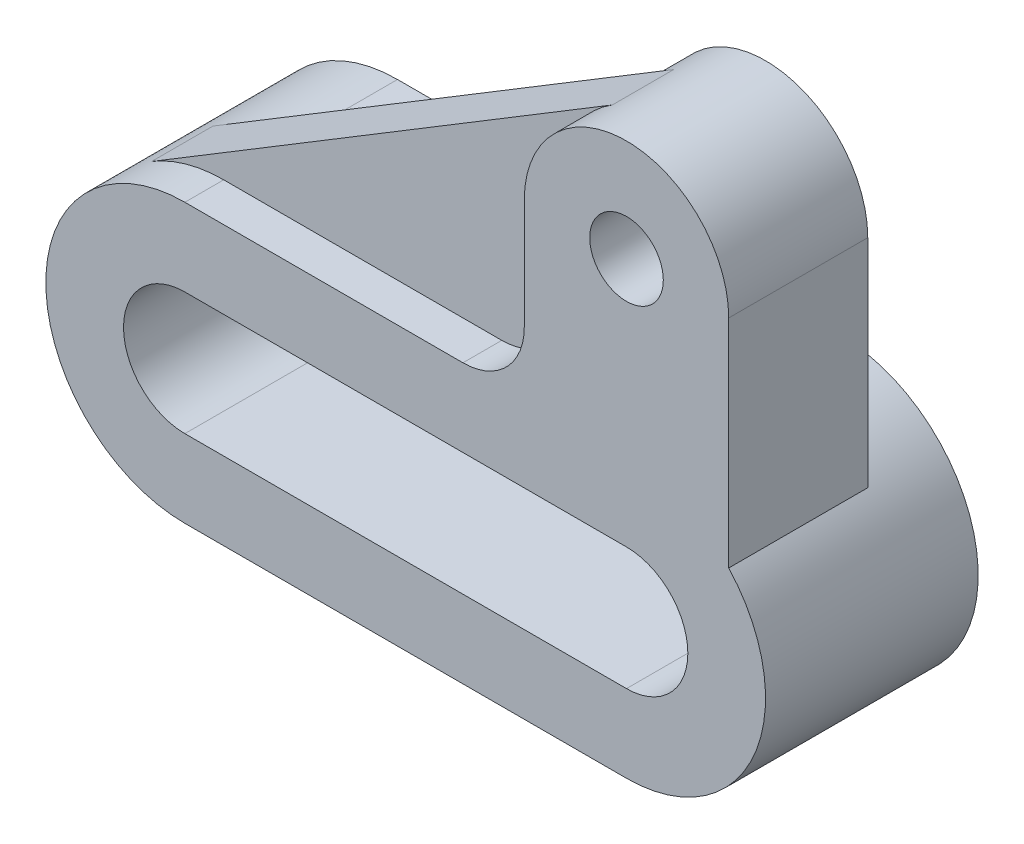
ISO-10303-21;
HEADER;
FILE_DESCRIPTION(('STEP AP214'),'2;1');
FILE_NAME('part.step','',(''),(''),'','','');
FILE_SCHEMA(('AUTOMOTIVE_DESIGN { 1 0 10303 214 1 1 1 1 }'));
ENDSEC;
DATA;
#1=APPLICATION_CONTEXT('core data for automotive mechanical design processes');
#2=APPLICATION_PROTOCOL_DEFINITION('international standard','automotive_design',2000,#1);
#3=PRODUCT_CONTEXT('',#1,'mechanical');
#4=PRODUCT('Part','Part','',(#3));
#5=PRODUCT_RELATED_PRODUCT_CATEGORY('part','',(#4));
#6=PRODUCT_DEFINITION_FORMATION('','',#4);
#7=PRODUCT_DEFINITION_CONTEXT('part definition',#1,'design');
#8=PRODUCT_DEFINITION('design','',#6,#7);
#9=PRODUCT_DEFINITION_SHAPE('','',#8);
#10=(LENGTH_UNIT() NAMED_UNIT(*) SI_UNIT(.MILLI.,.METRE.));
#11=(NAMED_UNIT(*) PLANE_ANGLE_UNIT() SI_UNIT($,.RADIAN.));
#12=(NAMED_UNIT(*) SI_UNIT($,.STERADIAN.) SOLID_ANGLE_UNIT());
#13=UNCERTAINTY_MEASURE_WITH_UNIT(LENGTH_MEASURE(1.E-05),#10,'distance_accuracy_value','');
#14=(GEOMETRIC_REPRESENTATION_CONTEXT(3) GLOBAL_UNCERTAINTY_ASSIGNED_CONTEXT((#13)) GLOBAL_UNIT_ASSIGNED_CONTEXT((#10,
#11,#12)) REPRESENTATION_CONTEXT('',''));
#15=CARTESIAN_POINT('',(0.,0.,0.));
#16=DIRECTION('',(0.,0.,1.));
#17=DIRECTION('',(1.,0.,0.));
#18=AXIS2_PLACEMENT_3D('',#15,#16,#17);
#19=CARTESIAN_POINT('',(-54.,34.,52.));
#20=DIRECTION('',(0.,-1.,0.));
#21=DIRECTION('',(1.,0.,0.));
#22=AXIS2_PLACEMENT_3D('',#19,#20,#21);
#23=PLANE('',#22);
#24=DIRECTION('',(-1.,0.,0.));
#25=VECTOR('',#24,1.);
#26=CARTESIAN_POINT('',(-54.,34.,27.5));
#27=LINE('',#26,#25);
#28=CARTESIAN_POINT('',(14.,34.,27.5));
#29=VERTEX_POINT('',#28);
#30=CARTESIAN_POINT('',(-54.,34.,27.5));
#31=VERTEX_POINT('',#30);
#32=EDGE_CURVE('E177',#29,#31,#27,.T.);
#33=ORIENTED_EDGE('',*,*,#32,.F.);
#34=DIRECTION('',(0.,0.,1.));
#35=VECTOR('',#34,1.);
#36=CARTESIAN_POINT('',(14.,34.,52.));
#37=LINE('',#36,#35);
#38=CARTESIAN_POINT('',(14.,34.,18.));
#39=VERTEX_POINT('',#38);
#40=EDGE_CURVE('E161',#29,#39,#37,.F.);
#41=ORIENTED_EDGE('',*,*,#40,.T.);
#42=DIRECTION('',(-1.,0.,0.));
#43=VECTOR('',#42,1.);
#44=CARTESIAN_POINT('',(54.,34.,18.));
#45=LINE('',#44,#43);
#46=CARTESIAN_POINT('',(54.,34.,18.));
#47=VERTEX_POINT('',#46);
#48=EDGE_CURVE('E280',#47,#39,#45,.T.);
#49=ORIENTED_EDGE('',*,*,#48,.F.);
#50=DIRECTION('',(0.,0.,-1.));
#51=VECTOR('',#50,1.);
#52=CARTESIAN_POINT('',(54.,34.,52.));
#53=LINE('',#52,#51);
#54=CARTESIAN_POINT('',(54.,34.,0.));
#55=VERTEX_POINT('',#54);
#56=EDGE_CURVE('E205',#47,#55,#53,.T.);
#57=ORIENTED_EDGE('',*,*,#56,.T.);
#58=DIRECTION('',(-1.,0.,0.));
#59=VECTOR('',#58,1.);
#60=CARTESIAN_POINT('',(-54.,34.,0.));
#61=LINE('',#60,#59);
#62=CARTESIAN_POINT('',(-54.,34.,0.));
#63=VERTEX_POINT('',#62);
#64=EDGE_CURVE('E209',#55,#63,#61,.T.);
#65=ORIENTED_EDGE('',*,*,#64,.T.);
#66=DIRECTION('',(0.,0.,-1.));
#67=VECTOR('',#66,1.);
#68=CARTESIAN_POINT('',(-54.,34.,52.));
#69=LINE('',#68,#67);
#70=EDGE_CURVE('E179',#31,#63,#69,.T.);
#71=ORIENTED_EDGE('',*,*,#70,.F.);
#72=EDGE_LOOP('',(#33,#41,#49,#57,#65,#71));
#73=FACE_BOUND('',#72,.T.);
#74=ADVANCED_FACE('F33',(#73),#23,.F.);
#75=CARTESIAN_POINT('',(29.,76.,18.));
#76=DIRECTION('',(-1.,0.,0.));
#77=DIRECTION('',(0.,-1.,0.));
#78=AXIS2_PLACEMENT_3D('',#75,#76,#77);
#79=PLANE('',#78);
#80=DIRECTION('',(0.,0.,1.));
#81=VECTOR('',#80,1.);
#82=CARTESIAN_POINT('',(29.,49.,18.));
#83=LINE('',#82,#81);
#84=CARTESIAN_POINT('',(29.,49.,18.));
#85=VERTEX_POINT('',#84);
#86=CARTESIAN_POINT('',(29.,49.,27.5));
#87=VERTEX_POINT('',#86);
#88=EDGE_CURVE('E173',#85,#87,#83,.T.);
#89=ORIENTED_EDGE('',*,*,#88,.T.);
#90=DIRECTION('',(0.,1.,0.));
#91=VECTOR('',#90,1.);
#92=CARTESIAN_POINT('',(29.,76.,27.5));
#93=LINE('',#92,#91);
#94=CARTESIAN_POINT('',(29.,76.,27.5));
#95=VERTEX_POINT('',#94);
#96=EDGE_CURVE('E187',#87,#95,#93,.T.);
#97=ORIENTED_EDGE('',*,*,#96,.T.);
#98=DIRECTION('',(0.,0.,1.));
#99=VECTOR('',#98,1.);
#100=CARTESIAN_POINT('',(29.,76.,18.));
#101=LINE('',#100,#99);
#102=CARTESIAN_POINT('',(29.,76.,18.));
#103=VERTEX_POINT('',#102);
#104=EDGE_CURVE('E260',#103,#95,#101,.T.);
#105=ORIENTED_EDGE('',*,*,#104,.F.);
#106=DIRECTION('',(0.,-1.,0.));
#107=VECTOR('',#106,1.);
#108=CARTESIAN_POINT('',(29.,76.,18.));
#109=LINE('',#108,#107);
#110=EDGE_CURVE('E282',#103,#85,#109,.T.);
#111=ORIENTED_EDGE('',*,*,#110,.T.);
#112=EDGE_LOOP('',(#89,#97,#105,#111));
#113=FACE_BOUND('',#112,.T.);
#114=ADVANCED_FACE('F339',(#113),#79,.T.);
#115=CARTESIAN_POINT('',(14.,49.,18.));
#116=DIRECTION('',(0.,0.,1.));
#117=DIRECTION('',(1.,0.,0.));
#118=AXIS2_PLACEMENT_3D('',#115,#116,#117);
#119=CYLINDRICAL_SURFACE('',#118,15.);
#120=CARTESIAN_POINT('',(14.,49.,27.5));
#121=DIRECTION('',(0.,0.,1.));
#122=DIRECTION('',(1.,0.,0.));
#123=AXIS2_PLACEMENT_3D('',#120,#121,#122);
#124=CIRCLE('',#123,15.);
#125=EDGE_CURVE('E166',#87,#29,#124,.F.);
#126=ORIENTED_EDGE('',*,*,#125,.F.);
#127=ORIENTED_EDGE('',*,*,#88,.F.);
#128=CARTESIAN_POINT('',(14.,49.,18.));
#129=DIRECTION('',(0.,0.,1.));
#130=DIRECTION('',(1.,0.,0.));
#131=AXIS2_PLACEMENT_3D('',#128,#129,#130);
#132=CIRCLE('',#131,15.);
#133=EDGE_CURVE('E168',#39,#85,#132,.T.);
#134=ORIENTED_EDGE('',*,*,#133,.F.);
#135=ORIENTED_EDGE('',*,*,#40,.F.);
#136=EDGE_LOOP('',(#126,#127,#134,#135));
#137=FACE_BOUND('',#136,.T.);
#138=ADVANCED_FACE('F163',(#137),#119,.F.);
#139=CARTESIAN_POINT('',(54.,0.,52.));
#140=DIRECTION('',(0.,0.,-1.));
#141=DIRECTION('',(-1.,0.,0.));
#142=AXIS2_PLACEMENT_3D('',#139,#140,#141);
#143=CYLINDRICAL_SURFACE('',#142,34.);
#144=DIRECTION('',(0.,0.,-1.));
#145=VECTOR('',#144,1.);
#146=CARTESIAN_POINT('',(54.,-34.,52.));
#147=LINE('',#146,#145);
#148=CARTESIAN_POINT('',(54.,-34.,52.));
#149=VERTEX_POINT('',#148);
#150=CARTESIAN_POINT('',(54.,-34.,0.));
#151=VERTEX_POINT('',#150);
#152=EDGE_CURVE('E203',#149,#151,#147,.T.);
#153=ORIENTED_EDGE('',*,*,#152,.T.);
#154=CARTESIAN_POINT('',(54.,0.,0.));
#155=DIRECTION('',(0.,0.,1.));
#156=DIRECTION('',(1.,0.,0.));
#157=AXIS2_PLACEMENT_3D('',#154,#155,#156);
#158=CIRCLE('',#157,34.);
#159=EDGE_CURVE('E212',#151,#55,#158,.T.);
#160=ORIENTED_EDGE('',*,*,#159,.T.);
#161=ORIENTED_EDGE('',*,*,#56,.F.);
#162=CARTESIAN_POINT('',(54.,0.,18.));
#163=DIRECTION('',(0.,0.,1.));
#164=DIRECTION('',(1.,0.,0.));
#165=AXIS2_PLACEMENT_3D('',#162,#163,#164);
#166=CIRCLE('',#165,34.);
#167=CARTESIAN_POINT('',(79.,23.0434372436058,18.));
#168=VERTEX_POINT('',#167);
#169=EDGE_CURVE('E278',#168,#47,#166,.T.);
#170=ORIENTED_EDGE('',*,*,#169,.F.);
#171=DIRECTION('',(0.,0.,1.));
#172=VECTOR('',#171,1.);
#173=CARTESIAN_POINT('',(79.,23.0434372436058,18.));
#174=LINE('',#173,#172);
#175=CARTESIAN_POINT('',(79.,23.0434372436058,52.));
#176=VERTEX_POINT('',#175);
#177=EDGE_CURVE('E263',#168,#176,#174,.T.);
#178=ORIENTED_EDGE('',*,*,#177,.T.);
#179=CARTESIAN_POINT('',(54.,0.,52.));
#180=DIRECTION('',(0.,0.,1.));
#181=DIRECTION('',(1.,0.,0.));
#182=AXIS2_PLACEMENT_3D('',#179,#180,#181);
#183=CIRCLE('',#182,34.);
#184=EDGE_CURVE('E224',#149,#176,#183,.T.);
#185=ORIENTED_EDGE('',*,*,#184,.F.);
#186=EDGE_LOOP('',(#153,#160,#161,#170,#178,#185));
#187=FACE_BOUND('',#186,.T.);
#188=ADVANCED_FACE('F371',(#187),#143,.T.);
#189=CARTESIAN_POINT('',(-54.,0.,52.));
#190=DIRECTION('',(0.,0.,1.));
#191=DIRECTION('',(1.,0.,0.));
#192=AXIS2_PLACEMENT_3D('',#189,#190,#191);
#193=PLANE('',#192);
#194=CARTESIAN_POINT('',(54.,76.,52.));
#195=DIRECTION('',(0.,0.,1.));
#196=DIRECTION('',(1.,0.,0.));
#197=AXIS2_PLACEMENT_3D('',#194,#195,#196);
#198=CIRCLE('',#197,9.00000000000001);
#199=CARTESIAN_POINT('',(63.,76.,52.));
#200=VERTEX_POINT('',#199);
#201=EDGE_CURVE('E200',#200,#200,#198,.T.);
#202=ORIENTED_EDGE('',*,*,#201,.F.);
#203=EDGE_LOOP('',(#202));
#204=FACE_BOUND('',#203,.T.);
#205=CARTESIAN_POINT('',(-54.,0.,52.));
#206=DIRECTION('',(0.,0.,1.));
#207=DIRECTION('',(1.,0.,0.));
#208=AXIS2_PLACEMENT_3D('',#205,#206,#207);
#209=CIRCLE('',#208,34.);
#210=CARTESIAN_POINT('',(-54.,34.,52.));
#211=VERTEX_POINT('',#210);
#212=CARTESIAN_POINT('',(-54.,-34.,52.));
#213=VERTEX_POINT('',#212);
#214=EDGE_CURVE('E211',#211,#213,#209,.T.);
#215=ORIENTED_EDGE('',*,*,#214,.T.);
#216=DIRECTION('',(1.,0.,0.));
#217=VECTOR('',#216,1.);
#218=CARTESIAN_POINT('',(-54.,-34.,52.));
#219=LINE('',#218,#217);
#220=EDGE_CURVE('E227',#213,#149,#219,.T.);
#221=ORIENTED_EDGE('',*,*,#220,.T.);
#222=ORIENTED_EDGE('',*,*,#184,.T.);
#223=DIRECTION('',(0.,-1.,0.));
#224=VECTOR('',#223,1.);
#225=CARTESIAN_POINT('',(79.,76.,52.));
#226=LINE('',#225,#224);
#227=CARTESIAN_POINT('',(79.,76.,52.));
#228=VERTEX_POINT('',#227);
#229=EDGE_CURVE('E267',#228,#176,#226,.T.);
#230=ORIENTED_EDGE('',*,*,#229,.F.);
#231=CARTESIAN_POINT('',(54.,76.,52.));
#232=DIRECTION('',(0.,0.,1.));
#233=DIRECTION('',(1.,0.,0.));
#234=AXIS2_PLACEMENT_3D('',#231,#232,#233);
#235=CIRCLE('',#234,25.);
#236=CARTESIAN_POINT('',(29.,76.,52.));
#237=VERTEX_POINT('',#236);
#238=EDGE_CURVE('E199',#228,#237,#235,.T.);
#239=ORIENTED_EDGE('',*,*,#238,.T.);
#240=DIRECTION('',(0.,-1.,0.));
#241=VECTOR('',#240,1.);
#242=CARTESIAN_POINT('',(29.,76.,52.));
#243=LINE('',#242,#241);
#244=CARTESIAN_POINT('',(29.,49.,52.));
#245=VERTEX_POINT('',#244);
#246=EDGE_CURVE('E271',#237,#245,#243,.T.);
#247=ORIENTED_EDGE('',*,*,#246,.T.);
#248=CARTESIAN_POINT('',(14.,49.,52.));
#249=DIRECTION('',(0.,0.,1.));
#250=DIRECTION('',(1.,0.,0.));
#251=AXIS2_PLACEMENT_3D('',#248,#249,#250);
#252=CIRCLE('',#251,15.);
#253=CARTESIAN_POINT('',(14.,34.,52.));
#254=VERTEX_POINT('',#253);
#255=EDGE_CURVE('E189',#245,#254,#252,.F.);
#256=ORIENTED_EDGE('',*,*,#255,.T.);
#257=DIRECTION('',(-1.,0.,0.));
#258=VECTOR('',#257,1.);
#259=CARTESIAN_POINT('',(-54.,34.,52.));
#260=LINE('',#259,#258);
#261=EDGE_CURVE('E222',#254,#211,#260,.T.);
#262=ORIENTED_EDGE('',*,*,#261,.T.);
#263=EDGE_LOOP('',(#215,#221,#222,#230,#239,#247,#256,#262));
#264=FACE_BOUND('',#263,.T.);
#265=DIRECTION('',(1.,0.,0.));
#266=VECTOR('',#265,1.);
#267=CARTESIAN_POINT('',(-54.,-15.,52.));
#268=LINE('',#267,#266);
#269=CARTESIAN_POINT('',(-54.,-15.,52.));
#270=VERTEX_POINT('',#269);
#271=CARTESIAN_POINT('',(54.,-15.,52.));
#272=VERTEX_POINT('',#271);
#273=EDGE_CURVE('E257',#270,#272,#268,.T.);
#274=ORIENTED_EDGE('',*,*,#273,.F.);
#275=CARTESIAN_POINT('',(-54.,0.,52.));
#276=DIRECTION('',(0.,0.,1.));
#277=DIRECTION('',(1.,0.,0.));
#278=AXIS2_PLACEMENT_3D('',#275,#276,#277);
#279=CIRCLE('',#278,15.);
#280=CARTESIAN_POINT('',(-54.,15.,52.));
#281=VERTEX_POINT('',#280);
#282=EDGE_CURVE('E242',#281,#270,#279,.T.);
#283=ORIENTED_EDGE('',*,*,#282,.F.);
#284=DIRECTION('',(-1.,0.,0.));
#285=VECTOR('',#284,1.);
#286=CARTESIAN_POINT('',(-54.,15.,52.));
#287=LINE('',#286,#285);
#288=CARTESIAN_POINT('',(54.,15.,52.));
#289=VERTEX_POINT('',#288);
#290=EDGE_CURVE('E238',#289,#281,#287,.T.);
#291=ORIENTED_EDGE('',*,*,#290,.F.);
#292=CARTESIAN_POINT('',(54.,0.,52.));
#293=DIRECTION('',(0.,0.,1.));
#294=DIRECTION('',(1.,0.,0.));
#295=AXIS2_PLACEMENT_3D('',#292,#293,#294);
#296=CIRCLE('',#295,15.);
#297=EDGE_CURVE('E254',#272,#289,#296,.T.);
#298=ORIENTED_EDGE('',*,*,#297,.F.);
#299=EDGE_LOOP('',(#274,#283,#291,#298));
#300=FACE_BOUND('',#299,.T.);
#301=ADVANCED_FACE('F327',(#204,#264,#300),#193,.T.);
#302=CARTESIAN_POINT('',(-54.,0.,0.));
#303=DIRECTION('',(0.,0.,1.));
#304=DIRECTION('',(1.,0.,0.));
#305=AXIS2_PLACEMENT_3D('',#302,#303,#304);
#306=PLANE('',#305);
#307=CARTESIAN_POINT('',(-54.,0.,0.));
#308=DIRECTION('',(0.,0.,1.));
#309=DIRECTION('',(1.,0.,0.));
#310=AXIS2_PLACEMENT_3D('',#307,#308,#309);
#311=CIRCLE('',#310,34.);
#312=CARTESIAN_POINT('',(-54.,-34.,0.));
#313=VERTEX_POINT('',#312);
#314=EDGE_CURVE('E218',#63,#313,#311,.T.);
#315=ORIENTED_EDGE('',*,*,#314,.F.);
#316=ORIENTED_EDGE('',*,*,#64,.F.);
#317=ORIENTED_EDGE('',*,*,#159,.F.);
#318=DIRECTION('',(1.,0.,0.));
#319=VECTOR('',#318,1.);
#320=CARTESIAN_POINT('',(-54.,-34.,0.));
#321=LINE('',#320,#319);
#322=EDGE_CURVE('E215',#313,#151,#321,.T.);
#323=ORIENTED_EDGE('',*,*,#322,.F.);
#324=EDGE_LOOP('',(#315,#316,#317,#323));
#325=FACE_BOUND('',#324,.T.);
#326=CARTESIAN_POINT('',(-54.,0.,0.));
#327=DIRECTION('',(0.,0.,1.));
#328=DIRECTION('',(1.,0.,0.));
#329=AXIS2_PLACEMENT_3D('',#326,#327,#328);
#330=CIRCLE('',#329,15.);
#331=CARTESIAN_POINT('',(-54.,15.,0.));
#332=VERTEX_POINT('',#331);
#333=CARTESIAN_POINT('',(-54.,-15.,0.));
#334=VERTEX_POINT('',#333);
#335=EDGE_CURVE('E249',#332,#334,#330,.T.);
#336=ORIENTED_EDGE('',*,*,#335,.T.);
#337=DIRECTION('',(1.,0.,0.));
#338=VECTOR('',#337,1.);
#339=CARTESIAN_POINT('',(-54.,-15.,0.));
#340=LINE('',#339,#338);
#341=CARTESIAN_POINT('',(54.,-15.,0.));
#342=VERTEX_POINT('',#341);
#343=EDGE_CURVE('E246',#334,#342,#340,.T.);
#344=ORIENTED_EDGE('',*,*,#343,.T.);
#345=CARTESIAN_POINT('',(54.,0.,0.));
#346=DIRECTION('',(0.,0.,1.));
#347=DIRECTION('',(1.,0.,0.));
#348=AXIS2_PLACEMENT_3D('',#345,#346,#347);
#349=CIRCLE('',#348,15.);
#350=CARTESIAN_POINT('',(54.,15.,0.));
#351=VERTEX_POINT('',#350);
#352=EDGE_CURVE('E243',#342,#351,#349,.T.);
#353=ORIENTED_EDGE('',*,*,#352,.T.);
#354=DIRECTION('',(-1.,0.,0.));
#355=VECTOR('',#354,1.);
#356=CARTESIAN_POINT('',(-54.,15.,0.));
#357=LINE('',#356,#355);
#358=EDGE_CURVE('E239',#351,#332,#357,.T.);
#359=ORIENTED_EDGE('',*,*,#358,.T.);
#360=EDGE_LOOP('',(#336,#344,#353,#359));
#361=FACE_BOUND('',#360,.T.);
#362=ADVANCED_FACE('F348',(#325,#361),#306,.F.);
#363=CARTESIAN_POINT('',(-54.,0.,52.));
#364=DIRECTION('',(0.,0.,-1.));
#365=DIRECTION('',(-1.,0.,0.));
#366=AXIS2_PLACEMENT_3D('',#363,#364,#365);
#367=CYLINDRICAL_SURFACE('',#366,34.);
#368=CARTESIAN_POINT('',(-54.,0.,42.5));
#369=DIRECTION('',(0.,0.,1.));
#370=DIRECTION('',(1.,0.,0.));
#371=AXIS2_PLACEMENT_3D('',#368,#369,#370);
#372=CIRCLE('',#371,34.);
#373=CARTESIAN_POINT('',(-54.,34.,42.5));
#374=VERTEX_POINT('',#373);
#375=CARTESIAN_POINT('',(-71.6263298981798,29.0742582763608,42.5));
#376=VERTEX_POINT('',#375);
#377=EDGE_CURVE('E48',#374,#376,#372,.T.);
#378=ORIENTED_EDGE('',*,*,#377,.T.);
#379=DIRECTION('',(0.,0.,-1.));
#380=VECTOR('',#379,1.);
#381=CARTESIAN_POINT('',(-71.6263298981798,29.0742582763608,52.));
#382=LINE('',#381,#380);
#383=CARTESIAN_POINT('',(-71.6263298981798,29.0742582763608,27.5));
#384=VERTEX_POINT('',#383);
#385=EDGE_CURVE('E52',#384,#376,#382,.F.);
#386=ORIENTED_EDGE('',*,*,#385,.F.);
#387=CARTESIAN_POINT('',(-54.,0.,27.5));
#388=DIRECTION('',(0.,0.,1.));
#389=DIRECTION('',(1.,0.,0.));
#390=AXIS2_PLACEMENT_3D('',#387,#388,#389);
#391=CIRCLE('',#390,34.);
#392=EDGE_CURVE('E181',#31,#384,#391,.T.);
#393=ORIENTED_EDGE('',*,*,#392,.F.);
#394=ORIENTED_EDGE('',*,*,#70,.T.);
#395=ORIENTED_EDGE('',*,*,#314,.T.);
#396=DIRECTION('',(0.,0.,-1.));
#397=VECTOR('',#396,1.);
#398=CARTESIAN_POINT('',(-54.,-34.,52.));
#399=LINE('',#398,#397);
#400=EDGE_CURVE('E201',#213,#313,#399,.T.);
#401=ORIENTED_EDGE('',*,*,#400,.F.);
#402=ORIENTED_EDGE('',*,*,#214,.F.);
#403=EDGE_CURVE('E207',#211,#374,#69,.T.);
#404=ORIENTED_EDGE('',*,*,#403,.T.);
#405=EDGE_LOOP('',(#378,#386,#393,#394,#395,#401,#402,#404));
#406=FACE_BOUND('',#405,.T.);
#407=ADVANCED_FACE('F340',(#406),#367,.T.);
#408=CARTESIAN_POINT('',(-54.,-34.,52.));
#409=DIRECTION('',(0.,1.,0.));
#410=DIRECTION('',(0.,0.,1.));
#411=AXIS2_PLACEMENT_3D('',#408,#409,#410);
#412=PLANE('',#411);
#413=ORIENTED_EDGE('',*,*,#400,.T.);
#414=ORIENTED_EDGE('',*,*,#322,.T.);
#415=ORIENTED_EDGE('',*,*,#152,.F.);
#416=ORIENTED_EDGE('',*,*,#220,.F.);
#417=EDGE_LOOP('',(#413,#414,#415,#416));
#418=FACE_BOUND('',#417,.T.);
#419=ADVANCED_FACE('F352',(#418),#412,.F.);
#420=CARTESIAN_POINT('',(14.,34.,42.5));
#421=VERTEX_POINT('',#420);
#422=EDGE_CURVE('E172',#254,#421,#37,.F.);
#423=ORIENTED_EDGE('',*,*,#422,.T.);
#424=DIRECTION('',(-1.,0.,0.));
#425=VECTOR('',#424,1.);
#426=CARTESIAN_POINT('',(-54.,34.,42.5));
#427=LINE('',#426,#425);
#428=EDGE_CURVE('E291',#421,#374,#427,.T.);
#429=ORIENTED_EDGE('',*,*,#428,.T.);
#430=ORIENTED_EDGE('',*,*,#403,.F.);
#431=ORIENTED_EDGE('',*,*,#261,.F.);
#432=EDGE_LOOP('',(#423,#429,#430,#431));
#433=FACE_BOUND('',#432,.T.);
#434=ADVANCED_FACE('F359',(#433),#23,.F.);
#435=CARTESIAN_POINT('',(-54.,0.,52.));
#436=DIRECTION('',(0.,0.,-1.));
#437=DIRECTION('',(-1.,0.,0.));
#438=AXIS2_PLACEMENT_3D('',#435,#436,#437);
#439=CYLINDRICAL_SURFACE('',#438,15.);
#440=DIRECTION('',(0.,0.,-1.));
#441=VECTOR('',#440,1.);
#442=CARTESIAN_POINT('',(-54.,-15.,52.));
#443=LINE('',#442,#441);
#444=EDGE_CURVE('E221',#270,#334,#443,.T.);
#445=ORIENTED_EDGE('',*,*,#444,.T.);
#446=ORIENTED_EDGE('',*,*,#335,.F.);
#447=DIRECTION('',(0.,0.,-1.));
#448=VECTOR('',#447,1.);
#449=CARTESIAN_POINT('',(-54.,15.,52.));
#450=LINE('',#449,#448);
#451=EDGE_CURVE('E236',#281,#332,#450,.T.);
#452=ORIENTED_EDGE('',*,*,#451,.F.);
#453=ORIENTED_EDGE('',*,*,#282,.T.);
#454=EDGE_LOOP('',(#445,#446,#452,#453));
#455=FACE_BOUND('',#454,.T.);
#456=ADVANCED_FACE('F381',(#455),#439,.F.);
#457=CARTESIAN_POINT('',(-54.,-15.,52.));
#458=DIRECTION('',(0.,1.,0.));
#459=DIRECTION('',(0.,0.,1.));
#460=AXIS2_PLACEMENT_3D('',#457,#458,#459);
#461=PLANE('',#460);
#462=DIRECTION('',(0.,0.,-1.));
#463=VECTOR('',#462,1.);
#464=CARTESIAN_POINT('',(54.,-15.,52.));
#465=LINE('',#464,#463);
#466=EDGE_CURVE('E232',#272,#342,#465,.T.);
#467=ORIENTED_EDGE('',*,*,#466,.T.);
#468=ORIENTED_EDGE('',*,*,#343,.F.);
#469=ORIENTED_EDGE('',*,*,#444,.F.);
#470=ORIENTED_EDGE('',*,*,#273,.T.);
#471=EDGE_LOOP('',(#467,#468,#469,#470));
#472=FACE_BOUND('',#471,.T.);
#473=ADVANCED_FACE('F386',(#472),#461,.T.);
#474=CARTESIAN_POINT('',(54.,0.,52.));
#475=DIRECTION('',(0.,0.,-1.));
#476=DIRECTION('',(-1.,0.,0.));
#477=AXIS2_PLACEMENT_3D('',#474,#475,#476);
#478=CYLINDRICAL_SURFACE('',#477,15.);
#479=DIRECTION('',(0.,0.,-1.));
#480=VECTOR('',#479,1.);
#481=CARTESIAN_POINT('',(54.,15.,52.));
#482=LINE('',#481,#480);
#483=EDGE_CURVE('E234',#289,#351,#482,.T.);
#484=ORIENTED_EDGE('',*,*,#483,.T.);
#485=ORIENTED_EDGE('',*,*,#352,.F.);
#486=ORIENTED_EDGE('',*,*,#466,.F.);
#487=ORIENTED_EDGE('',*,*,#297,.T.);
#488=EDGE_LOOP('',(#484,#485,#486,#487));
#489=FACE_BOUND('',#488,.T.);
#490=ADVANCED_FACE('F407',(#489),#478,.F.);
#491=CARTESIAN_POINT('',(-54.,15.,52.));
#492=DIRECTION('',(0.,-1.,0.));
#493=DIRECTION('',(0.,0.,-1.));
#494=AXIS2_PLACEMENT_3D('',#491,#492,#493);
#495=PLANE('',#494);
#496=ORIENTED_EDGE('',*,*,#451,.T.);
#497=ORIENTED_EDGE('',*,*,#358,.F.);
#498=ORIENTED_EDGE('',*,*,#483,.F.);
#499=ORIENTED_EDGE('',*,*,#290,.T.);
#500=EDGE_LOOP('',(#496,#497,#498,#499));
#501=FACE_BOUND('',#500,.T.);
#502=ADVANCED_FACE('F411',(#501),#495,.T.);
#503=CARTESIAN_POINT('',(54.,76.,18.));
#504=DIRECTION('',(0.,0.,1.));
#505=DIRECTION('',(1.,0.,0.));
#506=AXIS2_PLACEMENT_3D('',#503,#504,#505);
#507=CYLINDRICAL_SURFACE('',#506,25.);
#508=ORIENTED_EDGE('',*,*,#238,.F.);
#509=DIRECTION('',(0.,0.,1.));
#510=VECTOR('',#509,1.);
#511=CARTESIAN_POINT('',(79.,76.,18.));
#512=LINE('',#511,#510);
#513=CARTESIAN_POINT('',(79.,76.,18.));
#514=VERTEX_POINT('',#513);
#515=EDGE_CURVE('E252',#514,#228,#512,.T.);
#516=ORIENTED_EDGE('',*,*,#515,.F.);
#517=CARTESIAN_POINT('',(54.,76.,18.));
#518=DIRECTION('',(0.,0.,1.));
#519=DIRECTION('',(1.,0.,0.));
#520=AXIS2_PLACEMENT_3D('',#517,#518,#519);
#521=CIRCLE('',#520,25.);
#522=EDGE_CURVE('E270',#514,#103,#521,.T.);
#523=ORIENTED_EDGE('',*,*,#522,.T.);
#524=ORIENTED_EDGE('',*,*,#104,.T.);
#525=CARTESIAN_POINT('',(54.,76.,27.5));
#526=DIRECTION('',(0.,0.,1.));
#527=DIRECTION('',(1.,0.,0.));
#528=AXIS2_PLACEMENT_3D('',#525,#526,#527);
#529=CIRCLE('',#528,25.);
#530=CARTESIAN_POINT('',(41.0394633101619,97.3781310855594,27.5));
#531=VERTEX_POINT('',#530);
#532=EDGE_CURVE('E182',#95,#531,#529,.F.);
#533=ORIENTED_EDGE('',*,*,#532,.T.);
#534=DIRECTION('',(0.,0.,1.));
#535=VECTOR('',#534,1.);
#536=CARTESIAN_POINT('',(41.0394633101619,97.3781310855594,18.));
#537=LINE('',#536,#535);
#538=CARTESIAN_POINT('',(41.0394633101619,97.3781310855594,42.5));
#539=VERTEX_POINT('',#538);
#540=EDGE_CURVE('E11',#531,#539,#537,.T.);
#541=ORIENTED_EDGE('',*,*,#540,.T.);
#542=CARTESIAN_POINT('',(54.,76.,42.5));
#543=DIRECTION('',(0.,0.,1.));
#544=DIRECTION('',(1.,0.,0.));
#545=AXIS2_PLACEMENT_3D('',#542,#543,#544);
#546=CIRCLE('',#545,25.);
#547=CARTESIAN_POINT('',(29.,76.,42.5));
#548=VERTEX_POINT('',#547);
#549=EDGE_CURVE('E293',#548,#539,#546,.F.);
#550=ORIENTED_EDGE('',*,*,#549,.F.);
#551=EDGE_CURVE('E264',#548,#237,#101,.T.);
#552=ORIENTED_EDGE('',*,*,#551,.T.);
#553=EDGE_LOOP('',(#508,#516,#523,#524,#533,#541,#550,#552));
#554=FACE_BOUND('',#553,.T.);
#555=ADVANCED_FACE('F319',(#554),#507,.T.);
#556=CARTESIAN_POINT('',(79.,76.,18.));
#557=DIRECTION('',(-1.,0.,0.));
#558=DIRECTION('',(0.,-1.,0.));
#559=AXIS2_PLACEMENT_3D('',#556,#557,#558);
#560=PLANE('',#559);
#561=ORIENTED_EDGE('',*,*,#229,.T.);
#562=ORIENTED_EDGE('',*,*,#177,.F.);
#563=DIRECTION('',(0.,-1.,0.));
#564=VECTOR('',#563,1.);
#565=CARTESIAN_POINT('',(79.,76.,18.));
#566=LINE('',#565,#564);
#567=EDGE_CURVE('E276',#514,#168,#566,.T.);
#568=ORIENTED_EDGE('',*,*,#567,.F.);
#569=ORIENTED_EDGE('',*,*,#515,.T.);
#570=EDGE_LOOP('',(#561,#562,#568,#569));
#571=FACE_BOUND('',#570,.T.);
#572=ADVANCED_FACE('F333',(#571),#560,.F.);
#573=DIRECTION('',(0.,1.,0.));
#574=VECTOR('',#573,1.);
#575=CARTESIAN_POINT('',(29.,76.,42.5));
#576=LINE('',#575,#574);
#577=CARTESIAN_POINT('',(29.,49.,42.5));
#578=VERTEX_POINT('',#577);
#579=EDGE_CURVE('E296',#578,#548,#576,.T.);
#580=ORIENTED_EDGE('',*,*,#579,.F.);
#581=EDGE_CURVE('E195',#578,#245,#83,.T.);
#582=ORIENTED_EDGE('',*,*,#581,.T.);
#583=ORIENTED_EDGE('',*,*,#246,.F.);
#584=ORIENTED_EDGE('',*,*,#551,.F.);
#585=EDGE_LOOP('',(#580,#582,#583,#584));
#586=FACE_BOUND('',#585,.T.);
#587=ADVANCED_FACE('F322',(#586),#79,.T.);
#588=CARTESIAN_POINT('',(54.,76.,18.));
#589=DIRECTION('',(0.,0.,1.));
#590=DIRECTION('',(1.,0.,0.));
#591=AXIS2_PLACEMENT_3D('',#588,#589,#590);
#592=PLANE('',#591);
#593=CARTESIAN_POINT('',(54.,76.,18.));
#594=DIRECTION('',(0.,0.,1.));
#595=DIRECTION('',(1.,0.,0.));
#596=AXIS2_PLACEMENT_3D('',#593,#594,#595);
#597=CIRCLE('',#596,9.00000000000001);
#598=CARTESIAN_POINT('',(63.,76.,18.));
#599=VERTEX_POINT('',#598);
#600=EDGE_CURVE('E196',#599,#599,#597,.T.);
#601=ORIENTED_EDGE('',*,*,#600,.T.);
#602=EDGE_LOOP('',(#601));
#603=FACE_BOUND('',#602,.T.);
#604=ORIENTED_EDGE('',*,*,#522,.F.);
#605=ORIENTED_EDGE('',*,*,#567,.T.);
#606=ORIENTED_EDGE('',*,*,#169,.T.);
#607=ORIENTED_EDGE('',*,*,#48,.T.);
#608=ORIENTED_EDGE('',*,*,#133,.T.);
#609=ORIENTED_EDGE('',*,*,#110,.F.);
#610=EDGE_LOOP('',(#604,#605,#606,#607,#608,#609));
#611=FACE_BOUND('',#610,.T.);
#612=ADVANCED_FACE('F337',(#603,#611),#592,.F.);
#613=CARTESIAN_POINT('',(54.,76.,0.));
#614=DIRECTION('',(0.,0.,1.));
#615=DIRECTION('',(1.,0.,0.));
#616=AXIS2_PLACEMENT_3D('',#613,#614,#615);
#617=CYLINDRICAL_SURFACE('',#616,9.00000000000001);
#618=CARTESIAN_POINT('',(63.,76.,52.));
#619=CARTESIAN_POINT('',(63.,76.,51.6458333333333));
#620=CARTESIAN_POINT('',(63.,76.,51.2916666666667));
#621=CARTESIAN_POINT('',(63.,76.,50.5833333333333));
#622=CARTESIAN_POINT('',(63.,76.,50.2291666666667));
#623=CARTESIAN_POINT('',(63.,76.,49.5208333333333));
#624=CARTESIAN_POINT('',(63.,76.,49.1666666666667));
#625=CARTESIAN_POINT('',(63.,76.,48.4583333333333));
#626=CARTESIAN_POINT('',(63.,76.,48.1041666666667));
#627=CARTESIAN_POINT('',(63.,76.,47.3958333333333));
#628=CARTESIAN_POINT('',(63.,76.,47.0416666666667));
#629=CARTESIAN_POINT('',(63.,76.,46.3333333333333));
#630=CARTESIAN_POINT('',(63.,76.,45.9791666666667));
#631=CARTESIAN_POINT('',(63.,76.,45.2708333333333));
#632=CARTESIAN_POINT('',(63.,76.,44.9166666666667));
#633=CARTESIAN_POINT('',(63.,76.,44.2083333333333));
#634=CARTESIAN_POINT('',(63.,76.,43.8541666666667));
#635=CARTESIAN_POINT('',(63.,76.,43.1458333333333));
#636=CARTESIAN_POINT('',(63.,76.,42.7916666666667));
#637=CARTESIAN_POINT('',(63.,76.,42.0833333333333));
#638=CARTESIAN_POINT('',(63.,76.,41.7291666666667));
#639=CARTESIAN_POINT('',(63.,76.,41.0208333333333));
#640=CARTESIAN_POINT('',(63.,76.,40.6666666666667));
#641=CARTESIAN_POINT('',(63.,76.,39.9583333333333));
#642=CARTESIAN_POINT('',(63.,76.,39.6041666666667));
#643=CARTESIAN_POINT('',(63.,76.,38.8958333333333));
#644=CARTESIAN_POINT('',(63.,76.,38.5416666666667));
#645=CARTESIAN_POINT('',(63.,76.,37.8333333333333));
#646=CARTESIAN_POINT('',(63.,76.,37.4791666666667));
#647=CARTESIAN_POINT('',(63.,76.,36.7708333333333));
#648=CARTESIAN_POINT('',(63.,76.,36.4166666666667));
#649=CARTESIAN_POINT('',(63.,76.,35.7083333333333));
#650=CARTESIAN_POINT('',(63.,76.,35.3541666666667));
#651=CARTESIAN_POINT('',(63.,76.,34.6458333333333));
#652=CARTESIAN_POINT('',(63.,76.,34.2916666666667));
#653=CARTESIAN_POINT('',(63.,76.,33.5833333333333));
#654=CARTESIAN_POINT('',(63.,76.,33.2291666666667));
#655=CARTESIAN_POINT('',(63.,76.,32.5208333333333));
#656=CARTESIAN_POINT('',(63.,76.,32.1666666666667));
#657=CARTESIAN_POINT('',(63.,76.,31.4583333333333));
#658=CARTESIAN_POINT('',(63.,76.,31.1041666666667));
#659=CARTESIAN_POINT('',(63.,76.,30.3958333333333));
#660=CARTESIAN_POINT('',(63.,76.,30.0416666666667));
#661=CARTESIAN_POINT('',(63.,76.,29.3333333333333));
#662=CARTESIAN_POINT('',(63.,76.,28.9791666666667));
#663=CARTESIAN_POINT('',(63.,76.,28.2708333333333));
#664=CARTESIAN_POINT('',(63.,76.,27.9166666666667));
#665=CARTESIAN_POINT('',(63.,76.,27.2083333333333));
#666=CARTESIAN_POINT('',(63.,76.,26.8541666666667));
#667=CARTESIAN_POINT('',(63.,76.,26.1458333333333));
#668=CARTESIAN_POINT('',(63.,76.,25.7916666666667));
#669=CARTESIAN_POINT('',(63.,76.,25.0833333333333));
#670=CARTESIAN_POINT('',(63.,76.,24.7291666666667));
#671=CARTESIAN_POINT('',(63.,76.,24.0208333333333));
#672=CARTESIAN_POINT('',(63.,76.,23.6666666666667));
#673=CARTESIAN_POINT('',(63.,76.,22.9583333333333));
#674=CARTESIAN_POINT('',(63.,76.,22.6041666666667));
#675=CARTESIAN_POINT('',(63.,76.,21.8958333333333));
#676=CARTESIAN_POINT('',(63.,76.,21.5416666666667));
#677=CARTESIAN_POINT('',(63.,76.,20.8333333333333));
#678=CARTESIAN_POINT('',(63.,76.,20.4791666666667));
#679=CARTESIAN_POINT('',(63.,76.,19.7708333333333));
#680=CARTESIAN_POINT('',(63.,76.,19.4166666666667));
#681=CARTESIAN_POINT('',(63.,76.,18.7083333333333));
#682=CARTESIAN_POINT('',(63.,76.,18.3541666666667));
#683=CARTESIAN_POINT('',(63.,76.,18.));
#684=B_SPLINE_CURVE_WITH_KNOTS('',3,(#618,#619,#620,#621,#622,#623,#624,#625,#626,#627,#628,
#629,#630,#631,#632,#633,#634,#635,#636,#637,#638,#639,#640,#641,#642,#643,#644,#645,#646,#647,
#648,#649,#650,#651,#652,#653,#654,#655,#656,#657,#658,#659,#660,#661,#662,#663,#664,#665,#666,
#667,#668,#669,#670,#671,#672,#673,#674,#675,#676,#677,#678,#679,#680,#681,#682,#683),
.UNSPECIFIED.,.F.,.F.,(4,2,2,2,2,2,2,2,2,2,2,2,2,2,2,2,2,2,2,2,2,2,2,2,2,2,2,2,2,2,2,2,4),(0.,
1.0625,2.125,3.1875,4.25,5.3125,6.37500000000001,7.4375,8.5,9.5625,10.625,11.6875,12.75,13.8125,
14.875,15.9375,17.,18.0625,19.125,20.1875,21.25,22.3125,23.375,24.4375,25.5,26.5625,27.625,
28.6875,29.75,30.8125,31.875,32.9375,34.),.UNSPECIFIED.);
#685=EDGE_CURVE('BSEAM362',#200,#599,#684,.T.);
#686=ORIENTED_EDGE('',*,*,#201,.T.);
#687=ORIENTED_EDGE('',*,*,#600,.F.);
#688=ORIENTED_EDGE('',*,*,#685,.T.);
#689=ORIENTED_EDGE('',*,*,#685,.F.);
#690=EDGE_LOOP('',(#686,#688,#687,#689));
#691=FACE_BOUND('',#690,.T.);
#692=ADVANCED_FACE('F362',(#691),#617,.F.);
#693=ORIENTED_EDGE('',*,*,#581,.F.);
#694=CARTESIAN_POINT('',(14.,49.,42.5));
#695=DIRECTION('',(0.,0.,1.));
#696=DIRECTION('',(1.,0.,0.));
#697=AXIS2_PLACEMENT_3D('',#694,#695,#696);
#698=CIRCLE('',#697,15.);
#699=EDGE_CURVE('E41',#578,#421,#698,.F.);
#700=ORIENTED_EDGE('',*,*,#699,.T.);
#701=ORIENTED_EDGE('',*,*,#422,.F.);
#702=ORIENTED_EDGE('',*,*,#255,.F.);
#703=EDGE_LOOP('',(#693,#700,#701,#702));
#704=FACE_BOUND('',#703,.T.);
#705=ADVANCED_FACE('F35',(#704),#119,.F.);
#706=CARTESIAN_POINT('',(-71.6263298981798,29.0742582763608,35.));
#707=DIRECTION('',(0.518421467593524,-0.855125243422376,0.));
#708=DIRECTION('',(0.855125243422376,0.518421467593524,0.));
#709=AXIS2_PLACEMENT_3D('',#706,#707,#708);
#710=PLANE('',#709);
#711=DIRECTION('',(0.855125243422376,0.518421467593524,0.));
#712=VECTOR('',#711,1.);
#713=CARTESIAN_POINT('',(-71.6263298981798,29.0742582763608,27.5));
#714=LINE('',#713,#712);
#715=EDGE_CURVE('E303',#384,#531,#714,.T.);
#716=ORIENTED_EDGE('',*,*,#715,.F.);
#717=ORIENTED_EDGE('',*,*,#385,.T.);
#718=DIRECTION('',(0.855125243422376,0.518421467593524,0.));
#719=VECTOR('',#718,1.);
#720=CARTESIAN_POINT('',(-71.6263298981798,29.0742582763608,42.5));
#721=LINE('',#720,#719);
#722=EDGE_CURVE('E302',#376,#539,#721,.T.);
#723=ORIENTED_EDGE('',*,*,#722,.T.);
#724=ORIENTED_EDGE('',*,*,#540,.F.);
#725=EDGE_LOOP('',(#716,#717,#723,#724));
#726=FACE_BOUND('',#725,.T.);
#727=ADVANCED_FACE('F311',(#726),#710,.F.);
#728=CARTESIAN_POINT('',(0.,33.5,42.5));
#729=DIRECTION('',(0.,0.,1.));
#730=DIRECTION('',(1.,0.,0.));
#731=AXIS2_PLACEMENT_3D('',#728,#729,#730);
#732=PLANE('',#731);
#733=ORIENTED_EDGE('',*,*,#377,.F.);
#734=ORIENTED_EDGE('',*,*,#428,.F.);
#735=ORIENTED_EDGE('',*,*,#699,.F.);
#736=ORIENTED_EDGE('',*,*,#579,.T.);
#737=ORIENTED_EDGE('',*,*,#549,.T.);
#738=ORIENTED_EDGE('',*,*,#722,.F.);
#739=EDGE_LOOP('',(#733,#734,#735,#736,#737,#738));
#740=FACE_BOUND('',#739,.T.);
#741=ADVANCED_FACE('F313',(#740),#732,.T.);
#742=CARTESIAN_POINT('',(0.,33.5,27.5));
#743=DIRECTION('',(0.,0.,1.));
#744=DIRECTION('',(1.,0.,0.));
#745=AXIS2_PLACEMENT_3D('',#742,#743,#744);
#746=PLANE('',#745);
#747=ORIENTED_EDGE('',*,*,#32,.T.);
#748=ORIENTED_EDGE('',*,*,#392,.T.);
#749=ORIENTED_EDGE('',*,*,#715,.T.);
#750=ORIENTED_EDGE('',*,*,#532,.F.);
#751=ORIENTED_EDGE('',*,*,#96,.F.);
#752=ORIENTED_EDGE('',*,*,#125,.T.);
#753=EDGE_LOOP('',(#747,#748,#749,#750,#751,#752));
#754=FACE_BOUND('',#753,.T.);
#755=ADVANCED_FACE('F185',(#754),#746,.F.);
#756=CLOSED_SHELL('',(#74,#114,#138,#188,#301,#362,#407,#419,#434,#456,#473,#490,#502,#555,#572,
#587,#612,#692,#705,#727,#741,#755));
#757=MANIFOLD_SOLID_BREP('B2',#756);
#758=ADVANCED_BREP_SHAPE_REPRESENTATION('',(#18,#757),#14);
#759=SHAPE_DEFINITION_REPRESENTATION(#9,#758);
ENDSEC;
END-ISO-10303-21;
